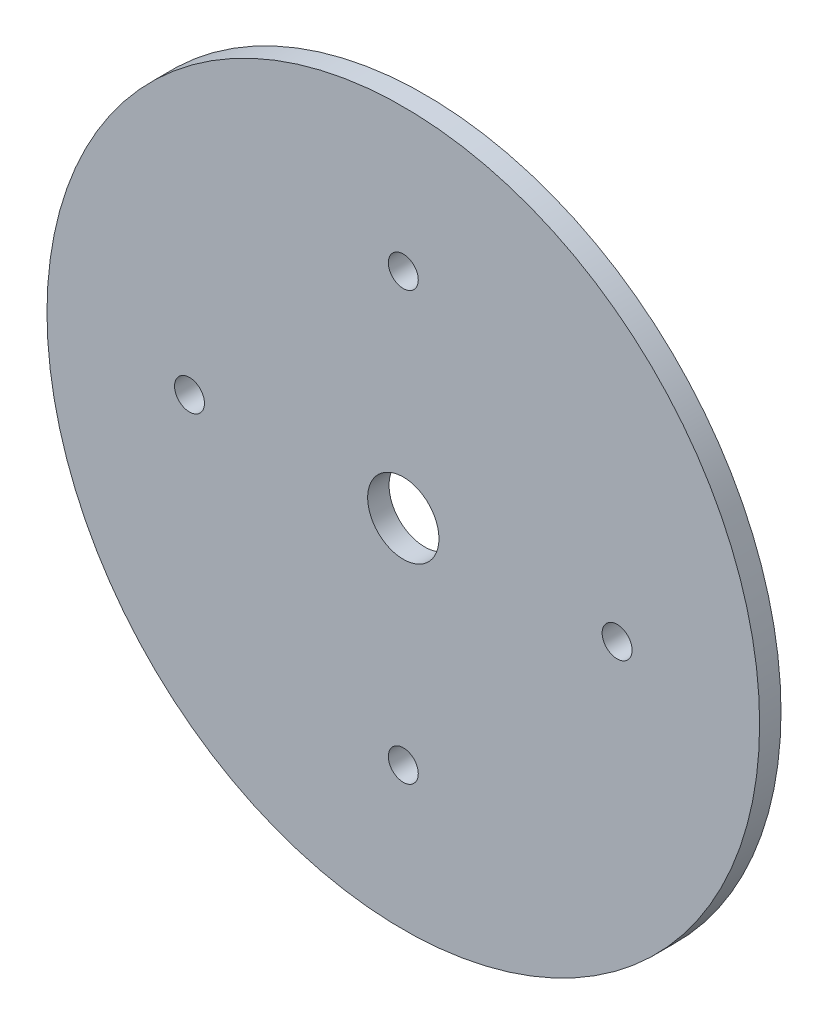
ISO-10303-21;
HEADER;
FILE_DESCRIPTION(('STEP AP214'),'2;1');
FILE_NAME('part.step','',(''),(''),'','','');
FILE_SCHEMA(('AUTOMOTIVE_DESIGN { 1 0 10303 214 1 1 1 1 }'));
ENDSEC;
DATA;
#1=APPLICATION_CONTEXT('core data for automotive mechanical design processes');
#2=APPLICATION_PROTOCOL_DEFINITION('international standard','automotive_design',2000,#1);
#3=PRODUCT_CONTEXT('',#1,'mechanical');
#4=PRODUCT('Part','Part','',(#3));
#5=PRODUCT_RELATED_PRODUCT_CATEGORY('part','',(#4));
#6=PRODUCT_DEFINITION_FORMATION('','',#4);
#7=PRODUCT_DEFINITION_CONTEXT('part definition',#1,'design');
#8=PRODUCT_DEFINITION('design','',#6,#7);
#9=PRODUCT_DEFINITION_SHAPE('','',#8);
#10=(LENGTH_UNIT() NAMED_UNIT(*) SI_UNIT(.MILLI.,.METRE.));
#11=(NAMED_UNIT(*) PLANE_ANGLE_UNIT() SI_UNIT($,.RADIAN.));
#12=(NAMED_UNIT(*) SI_UNIT($,.STERADIAN.) SOLID_ANGLE_UNIT());
#13=UNCERTAINTY_MEASURE_WITH_UNIT(LENGTH_MEASURE(1.E-05),#10,'distance_accuracy_value','');
#14=(GEOMETRIC_REPRESENTATION_CONTEXT(3) GLOBAL_UNCERTAINTY_ASSIGNED_CONTEXT((#13)) GLOBAL_UNIT_ASSIGNED_CONTEXT((#10,
#11,#12)) REPRESENTATION_CONTEXT('',''));
#15=CARTESIAN_POINT('',(0.,0.,0.));
#16=DIRECTION('',(0.,0.,1.));
#17=DIRECTION('',(1.,0.,0.));
#18=AXIS2_PLACEMENT_3D('',#15,#16,#17);
#19=CARTESIAN_POINT('',(-2.65065747129256E-12,-1.85962356624714E-12,3.));
#20=DIRECTION('',(0.,0.,1.));
#21=DIRECTION('',(1.,0.,0.));
#22=AXIS2_PLACEMENT_3D('',#19,#20,#21);
#23=PLANE('',#22);
#24=CARTESIAN_POINT('',(0.,30.,3.));
#25=DIRECTION('',(0.,0.,1.));
#26=DIRECTION('',(1.,0.,0.));
#27=AXIS2_PLACEMENT_3D('',#24,#25,#26);
#28=CIRCLE('',#27,2.1);
#29=CARTESIAN_POINT('',(2.1,30.,3.));
#30=VERTEX_POINT('',#29);
#31=EDGE_CURVE('E63',#30,#30,#28,.T.);
#32=ORIENTED_EDGE('',*,*,#31,.F.);
#33=EDGE_LOOP('',(#32));
#34=FACE_BOUND('',#33,.T.);
#35=CARTESIAN_POINT('',(-1.69428074463191E-12,-30.,3.));
#36=DIRECTION('',(0.,0.,1.));
#37=DIRECTION('',(1.,0.,0.));
#38=AXIS2_PLACEMENT_3D('',#35,#36,#37);
#39=CIRCLE('',#38,2.10000000000182);
#40=CARTESIAN_POINT('',(2.10000000000013,-30.,3.));
#41=VERTEX_POINT('',#40);
#42=EDGE_CURVE('E51',#41,#41,#39,.T.);
#43=ORIENTED_EDGE('',*,*,#42,.F.);
#44=EDGE_LOOP('',(#43));
#45=FACE_BOUND('',#44,.T.);
#46=CARTESIAN_POINT('',(-2.65065747129256E-12,-1.85962356624714E-12,3.));
#47=DIRECTION('',(0.,0.,1.));
#48=DIRECTION('',(1.,0.,0.));
#49=AXIS2_PLACEMENT_3D('',#46,#47,#48);
#50=CIRCLE('',#49,49.9999999999866);
#51=CARTESIAN_POINT('',(49.9999999999839,-1.85962356624714E-12,3.));
#52=VERTEX_POINT('',#51);
#53=EDGE_CURVE('E10',#52,#52,#50,.T.);
#54=ORIENTED_EDGE('',*,*,#53,.T.);
#55=EDGE_LOOP('',(#54));
#56=FACE_BOUND('',#55,.T.);
#57=CARTESIAN_POINT('',(0.,0.,3.));
#58=DIRECTION('',(0.,0.,1.));
#59=DIRECTION('',(1.,0.,0.));
#60=AXIS2_PLACEMENT_3D('',#57,#58,#59);
#61=CIRCLE('',#60,5.);
#62=CARTESIAN_POINT('',(5.,0.,3.));
#63=VERTEX_POINT('',#62);
#64=EDGE_CURVE('E46',#63,#63,#61,.T.);
#65=ORIENTED_EDGE('',*,*,#64,.F.);
#66=EDGE_LOOP('',(#65));
#67=FACE_BOUND('',#66,.T.);
#68=CARTESIAN_POINT('',(-30.0000000000008,8.47140372315957E-13,3.));
#69=DIRECTION('',(0.,0.,1.));
#70=DIRECTION('',(1.,0.,0.));
#71=AXIS2_PLACEMENT_3D('',#68,#69,#70);
#72=CIRCLE('',#71,2.10000000000067);
#73=CARTESIAN_POINT('',(-27.9000000000002,8.47140372315957E-13,3.));
#74=VERTEX_POINT('',#73);
#75=EDGE_CURVE('E57',#74,#74,#72,.T.);
#76=ORIENTED_EDGE('',*,*,#75,.F.);
#77=EDGE_LOOP('',(#76));
#78=FACE_BOUND('',#77,.T.);
#79=CARTESIAN_POINT('',(29.9999999999992,-8.50814312713399E-13,3.));
#80=DIRECTION('',(0.,0.,1.));
#81=DIRECTION('',(1.,0.,0.));
#82=AXIS2_PLACEMENT_3D('',#79,#80,#81);
#83=CIRCLE('',#82,2.10000000000137);
#84=CARTESIAN_POINT('',(32.1000000000005,-8.50814312713399E-13,3.));
#85=VERTEX_POINT('',#84);
#86=EDGE_CURVE('E69',#85,#85,#83,.T.);
#87=ORIENTED_EDGE('',*,*,#86,.F.);
#88=EDGE_LOOP('',(#87));
#89=FACE_BOUND('',#88,.T.);
#90=ADVANCED_FACE('F35',(#34,#45,#56,#67,#78,#89),#23,.T.);
#91=CARTESIAN_POINT('',(-2.65065747129256E-12,-1.85962356624714E-12,0.));
#92=DIRECTION('',(0.,0.,1.));
#93=DIRECTION('',(1.,0.,0.));
#94=AXIS2_PLACEMENT_3D('',#91,#92,#93);
#95=PLANE('',#94);
#96=CARTESIAN_POINT('',(-2.65065747129256E-12,-1.85962356624714E-12,0.));
#97=DIRECTION('',(0.,0.,1.));
#98=DIRECTION('',(1.,0.,0.));
#99=AXIS2_PLACEMENT_3D('',#96,#97,#98);
#100=CIRCLE('',#99,49.9999999999866);
#101=CARTESIAN_POINT('',(49.9999999999839,-1.85962356624714E-12,0.));
#102=VERTEX_POINT('',#101);
#103=EDGE_CURVE('E39',#102,#102,#100,.T.);
#104=ORIENTED_EDGE('',*,*,#103,.F.);
#105=EDGE_LOOP('',(#104));
#106=FACE_BOUND('',#105,.T.);
#107=CARTESIAN_POINT('',(0.,0.,0.));
#108=DIRECTION('',(0.,0.,1.));
#109=DIRECTION('',(1.,0.,0.));
#110=AXIS2_PLACEMENT_3D('',#107,#108,#109);
#111=CIRCLE('',#110,5.);
#112=CARTESIAN_POINT('',(5.,0.,0.));
#113=VERTEX_POINT('',#112);
#114=EDGE_CURVE('E48',#113,#113,#111,.T.);
#115=ORIENTED_EDGE('',*,*,#114,.T.);
#116=EDGE_LOOP('',(#115));
#117=FACE_BOUND('',#116,.T.);
#118=CARTESIAN_POINT('',(-1.69428074463191E-12,-30.,0.));
#119=DIRECTION('',(0.,0.,1.));
#120=DIRECTION('',(1.,0.,0.));
#121=AXIS2_PLACEMENT_3D('',#118,#119,#120);
#122=CIRCLE('',#121,2.10000000000182);
#123=CARTESIAN_POINT('',(2.10000000000013,-30.,0.));
#124=VERTEX_POINT('',#123);
#125=EDGE_CURVE('E54',#124,#124,#122,.T.);
#126=ORIENTED_EDGE('',*,*,#125,.T.);
#127=EDGE_LOOP('',(#126));
#128=FACE_BOUND('',#127,.T.);
#129=CARTESIAN_POINT('',(-30.0000000000008,8.47140372315957E-13,0.));
#130=DIRECTION('',(0.,0.,1.));
#131=DIRECTION('',(1.,0.,0.));
#132=AXIS2_PLACEMENT_3D('',#129,#130,#131);
#133=CIRCLE('',#132,2.10000000000067);
#134=CARTESIAN_POINT('',(-27.9000000000002,8.47140372315957E-13,0.));
#135=VERTEX_POINT('',#134);
#136=EDGE_CURVE('E60',#135,#135,#133,.T.);
#137=ORIENTED_EDGE('',*,*,#136,.T.);
#138=EDGE_LOOP('',(#137));
#139=FACE_BOUND('',#138,.T.);
#140=CARTESIAN_POINT('',(0.,30.,0.));
#141=DIRECTION('',(0.,0.,1.));
#142=DIRECTION('',(1.,0.,0.));
#143=AXIS2_PLACEMENT_3D('',#140,#141,#142);
#144=CIRCLE('',#143,2.1);
#145=CARTESIAN_POINT('',(2.1,30.,0.));
#146=VERTEX_POINT('',#145);
#147=EDGE_CURVE('E66',#146,#146,#144,.T.);
#148=ORIENTED_EDGE('',*,*,#147,.T.);
#149=EDGE_LOOP('',(#148));
#150=FACE_BOUND('',#149,.T.);
#151=CARTESIAN_POINT('',(29.9999999999992,-8.50814312713399E-13,0.));
#152=DIRECTION('',(0.,0.,1.));
#153=DIRECTION('',(1.,0.,0.));
#154=AXIS2_PLACEMENT_3D('',#151,#152,#153);
#155=CIRCLE('',#154,2.10000000000137);
#156=CARTESIAN_POINT('',(32.1000000000005,-8.50814312713399E-13,0.));
#157=VERTEX_POINT('',#156);
#158=EDGE_CURVE('E72',#157,#157,#155,.T.);
#159=ORIENTED_EDGE('',*,*,#158,.T.);
#160=EDGE_LOOP('',(#159));
#161=FACE_BOUND('',#160,.T.);
#162=ADVANCED_FACE('F82',(#106,#117,#128,#139,#150,#161),#95,.F.);
#163=CARTESIAN_POINT('',(-2.65065747129256E-12,-1.85962356624714E-12,3.));
#164=DIRECTION('',(0.,0.,-1.));
#165=DIRECTION('',(-1.,0.,0.));
#166=AXIS2_PLACEMENT_3D('',#163,#164,#165);
#167=CYLINDRICAL_SURFACE('',#166,49.9999999999866);
#168=ORIENTED_EDGE('',*,*,#53,.F.);
#169=EDGE_LOOP('',(#168));
#170=FACE_BOUND('',#169,.T.);
#171=ORIENTED_EDGE('',*,*,#103,.T.);
#172=EDGE_LOOP('',(#171));
#173=FACE_BOUND('',#172,.T.);
#174=ADVANCED_FACE('F37',(#170,#173),#167,.T.);
#175=CARTESIAN_POINT('',(0.,0.,3.));
#176=DIRECTION('',(0.,0.,-1.));
#177=DIRECTION('',(-1.,0.,0.));
#178=AXIS2_PLACEMENT_3D('',#175,#176,#177);
#179=CYLINDRICAL_SURFACE('',#178,5.);
#180=ORIENTED_EDGE('',*,*,#64,.T.);
#181=EDGE_LOOP('',(#180));
#182=FACE_BOUND('',#181,.T.);
#183=ORIENTED_EDGE('',*,*,#114,.F.);
#184=EDGE_LOOP('',(#183));
#185=FACE_BOUND('',#184,.T.);
#186=ADVANCED_FACE('F92',(#182,#185),#179,.F.);
#187=CARTESIAN_POINT('',(-1.69428074463191E-12,-30.,3.));
#188=DIRECTION('',(0.,0.,-1.));
#189=DIRECTION('',(-1.,0.,0.));
#190=AXIS2_PLACEMENT_3D('',#187,#188,#189);
#191=CYLINDRICAL_SURFACE('',#190,2.10000000000182);
#192=ORIENTED_EDGE('',*,*,#42,.T.);
#193=EDGE_LOOP('',(#192));
#194=FACE_BOUND('',#193,.T.);
#195=ORIENTED_EDGE('',*,*,#125,.F.);
#196=EDGE_LOOP('',(#195));
#197=FACE_BOUND('',#196,.T.);
#198=ADVANCED_FACE('F95',(#194,#197),#191,.F.);
#199=CARTESIAN_POINT('',(-30.0000000000008,8.47140372315957E-13,3.));
#200=DIRECTION('',(0.,0.,-1.));
#201=DIRECTION('',(-1.,0.,0.));
#202=AXIS2_PLACEMENT_3D('',#199,#200,#201);
#203=CYLINDRICAL_SURFACE('',#202,2.10000000000067);
#204=ORIENTED_EDGE('',*,*,#75,.T.);
#205=EDGE_LOOP('',(#204));
#206=FACE_BOUND('',#205,.T.);
#207=ORIENTED_EDGE('',*,*,#136,.F.);
#208=EDGE_LOOP('',(#207));
#209=FACE_BOUND('',#208,.T.);
#210=ADVANCED_FACE('F99',(#206,#209),#203,.F.);
#211=CARTESIAN_POINT('',(0.,30.,3.));
#212=DIRECTION('',(0.,0.,-1.));
#213=DIRECTION('',(-1.,0.,0.));
#214=AXIS2_PLACEMENT_3D('',#211,#212,#213);
#215=CYLINDRICAL_SURFACE('',#214,2.1);
#216=ORIENTED_EDGE('',*,*,#31,.T.);
#217=EDGE_LOOP('',(#216));
#218=FACE_BOUND('',#217,.T.);
#219=ORIENTED_EDGE('',*,*,#147,.F.);
#220=EDGE_LOOP('',(#219));
#221=FACE_BOUND('',#220,.T.);
#222=ADVANCED_FACE('F103',(#218,#221),#215,.F.);
#223=CARTESIAN_POINT('',(29.9999999999992,-8.50814312713399E-13,3.));
#224=DIRECTION('',(0.,0.,-1.));
#225=DIRECTION('',(-1.,0.,0.));
#226=AXIS2_PLACEMENT_3D('',#223,#224,#225);
#227=CYLINDRICAL_SURFACE('',#226,2.10000000000137);
#228=ORIENTED_EDGE('',*,*,#86,.T.);
#229=EDGE_LOOP('',(#228));
#230=FACE_BOUND('',#229,.T.);
#231=ORIENTED_EDGE('',*,*,#158,.F.);
#232=EDGE_LOOP('',(#231));
#233=FACE_BOUND('',#232,.T.);
#234=ADVANCED_FACE('F78',(#230,#233),#227,.F.);
#235=CLOSED_SHELL('',(#90,#162,#174,#186,#198,#210,#222,#234));
#236=MANIFOLD_SOLID_BREP('B2',#235);
#237=ADVANCED_BREP_SHAPE_REPRESENTATION('',(#18,#236),#14);
#238=SHAPE_DEFINITION_REPRESENTATION(#9,#237);
ENDSEC;
END-ISO-10303-21;
